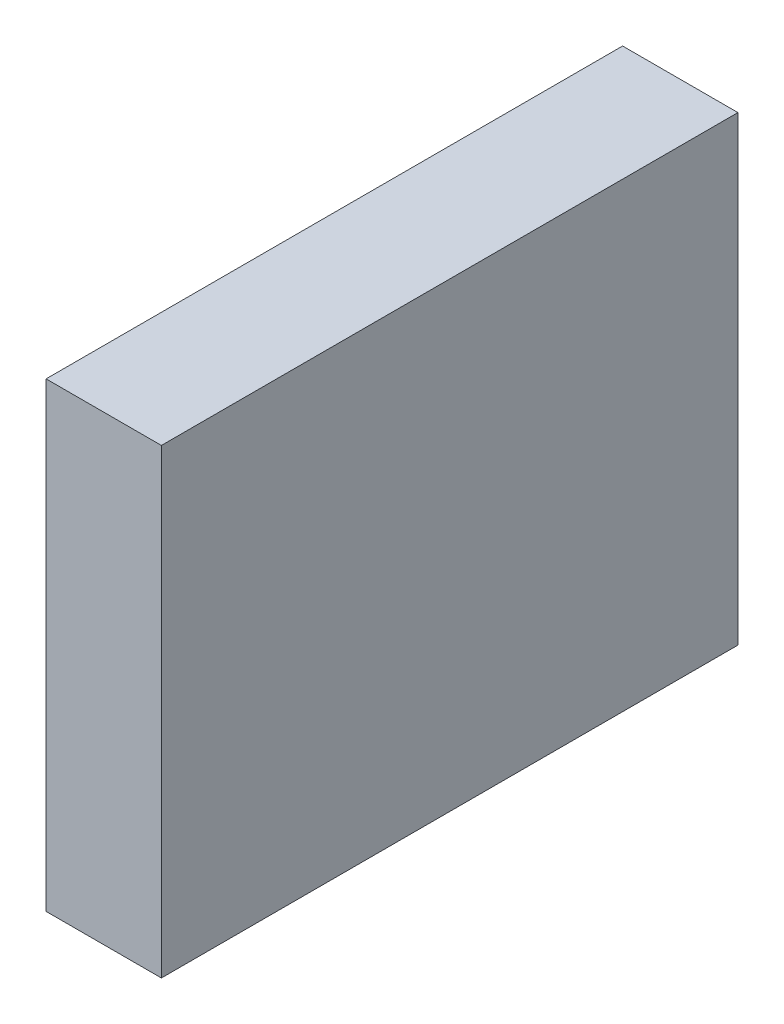
ISO-10303-21;
HEADER;
FILE_DESCRIPTION(('STEP AP214'),'2;1');
FILE_NAME('part.step','',(''),(''),'','','');
FILE_SCHEMA(('AUTOMOTIVE_DESIGN { 1 0 10303 214 1 1 1 1 }'));
ENDSEC;
DATA;
#1=APPLICATION_CONTEXT('core data for automotive mechanical design processes');
#2=APPLICATION_PROTOCOL_DEFINITION('international standard','automotive_design',2000,#1);
#3=PRODUCT_CONTEXT('',#1,'mechanical');
#4=PRODUCT('Part','Part','',(#3));
#5=PRODUCT_RELATED_PRODUCT_CATEGORY('part','',(#4));
#6=PRODUCT_DEFINITION_FORMATION('','',#4);
#7=PRODUCT_DEFINITION_CONTEXT('part definition',#1,'design');
#8=PRODUCT_DEFINITION('design','',#6,#7);
#9=PRODUCT_DEFINITION_SHAPE('','',#8);
#10=(LENGTH_UNIT() NAMED_UNIT(*) SI_UNIT(.MILLI.,.METRE.));
#11=(NAMED_UNIT(*) PLANE_ANGLE_UNIT() SI_UNIT($,.RADIAN.));
#12=(NAMED_UNIT(*) SI_UNIT($,.STERADIAN.) SOLID_ANGLE_UNIT());
#13=UNCERTAINTY_MEASURE_WITH_UNIT(LENGTH_MEASURE(1.E-05),#10,'distance_accuracy_value','');
#14=(GEOMETRIC_REPRESENTATION_CONTEXT(3) GLOBAL_UNCERTAINTY_ASSIGNED_CONTEXT((#13)) GLOBAL_UNIT_ASSIGNED_CONTEXT((#10,
#11,#12)) REPRESENTATION_CONTEXT('',''));
#15=CARTESIAN_POINT('',(0.,0.,0.));
#16=DIRECTION('',(0.,0.,1.));
#17=DIRECTION('',(1.,0.,0.));
#18=AXIS2_PLACEMENT_3D('',#15,#16,#17);
#19=CARTESIAN_POINT('',(-5.,40.,-25.));
#20=DIRECTION('',(1.,0.,0.));
#21=DIRECTION('',(0.,0.,-1.));
#22=AXIS2_PLACEMENT_3D('',#19,#20,#21);
#23=PLANE('',#22);
#24=DIRECTION('',(0.,0.,1.));
#25=VECTOR('',#24,1.);
#26=CARTESIAN_POINT('',(-5.,0.,-25.));
#27=LINE('',#26,#25);
#28=CARTESIAN_POINT('',(-5.,0.,-25.));
#29=VERTEX_POINT('',#28);
#30=CARTESIAN_POINT('',(-5.,0.,25.));
#31=VERTEX_POINT('',#30);
#32=EDGE_CURVE('E114',#29,#31,#27,.T.);
#33=ORIENTED_EDGE('',*,*,#32,.T.);
#34=DIRECTION('',(0.,-1.,0.));
#35=VECTOR('',#34,1.);
#36=CARTESIAN_POINT('',(-5.,40.,25.));
#37=LINE('',#36,#35);
#38=CARTESIAN_POINT('',(-5.,40.,25.));
#39=VERTEX_POINT('',#38);
#40=EDGE_CURVE('E11',#39,#31,#37,.T.);
#41=ORIENTED_EDGE('',*,*,#40,.F.);
#42=DIRECTION('',(0.,0.,1.));
#43=VECTOR('',#42,1.);
#44=CARTESIAN_POINT('',(-5.,40.,-25.));
#45=LINE('',#44,#43);
#46=CARTESIAN_POINT('',(-5.,40.,-25.));
#47=VERTEX_POINT('',#46);
#48=EDGE_CURVE('E100',#47,#39,#45,.T.);
#49=ORIENTED_EDGE('',*,*,#48,.F.);
#50=DIRECTION('',(0.,-1.,0.));
#51=VECTOR('',#50,1.);
#52=CARTESIAN_POINT('',(-5.,40.,-25.));
#53=LINE('',#52,#51);
#54=EDGE_CURVE('E108',#47,#29,#53,.T.);
#55=ORIENTED_EDGE('',*,*,#54,.T.);
#56=EDGE_LOOP('',(#33,#41,#49,#55));
#57=FACE_BOUND('',#56,.T.);
#58=ADVANCED_FACE('F44',(#57),#23,.F.);
#59=CARTESIAN_POINT('',(5.,40.,25.));
#60=DIRECTION('',(0.,0.,-1.));
#61=DIRECTION('',(-1.,0.,0.));
#62=AXIS2_PLACEMENT_3D('',#59,#60,#61);
#63=PLANE('',#62);
#64=DIRECTION('',(1.,0.,0.));
#65=VECTOR('',#64,1.);
#66=CARTESIAN_POINT('',(5.,0.,25.));
#67=LINE('',#66,#65);
#68=CARTESIAN_POINT('',(5.,0.,25.));
#69=VERTEX_POINT('',#68);
#70=EDGE_CURVE('E105',#31,#69,#67,.T.);
#71=ORIENTED_EDGE('',*,*,#70,.T.);
#72=DIRECTION('',(0.,-1.,0.));
#73=VECTOR('',#72,1.);
#74=CARTESIAN_POINT('',(5.,40.,25.));
#75=LINE('',#74,#73);
#76=CARTESIAN_POINT('',(5.,40.,25.));
#77=VERTEX_POINT('',#76);
#78=EDGE_CURVE('E53',#77,#69,#75,.T.);
#79=ORIENTED_EDGE('',*,*,#78,.F.);
#80=DIRECTION('',(1.,0.,0.));
#81=VECTOR('',#80,1.);
#82=CARTESIAN_POINT('',(5.,40.,25.));
#83=LINE('',#82,#81);
#84=EDGE_CURVE('E95',#39,#77,#83,.T.);
#85=ORIENTED_EDGE('',*,*,#84,.F.);
#86=ORIENTED_EDGE('',*,*,#40,.T.);
#87=EDGE_LOOP('',(#71,#79,#85,#86));
#88=FACE_BOUND('',#87,.T.);
#89=ADVANCED_FACE('F101',(#88),#63,.F.);
#90=CARTESIAN_POINT('',(5.,40.,-25.));
#91=DIRECTION('',(-1.,0.,0.));
#92=DIRECTION('',(0.,0.,1.));
#93=AXIS2_PLACEMENT_3D('',#90,#91,#92);
#94=PLANE('',#93);
#95=DIRECTION('',(0.,0.,-1.));
#96=VECTOR('',#95,1.);
#97=CARTESIAN_POINT('',(5.,0.,-25.));
#98=LINE('',#97,#96);
#99=CARTESIAN_POINT('',(5.,0.,-25.));
#100=VERTEX_POINT('',#99);
#101=EDGE_CURVE('E78',#69,#100,#98,.T.);
#102=ORIENTED_EDGE('',*,*,#101,.T.);
#103=DIRECTION('',(0.,-1.,0.));
#104=VECTOR('',#103,1.);
#105=CARTESIAN_POINT('',(5.,40.,-25.));
#106=LINE('',#105,#104);
#107=CARTESIAN_POINT('',(5.,40.,-25.));
#108=VERTEX_POINT('',#107);
#109=EDGE_CURVE('E102',#108,#100,#106,.T.);
#110=ORIENTED_EDGE('',*,*,#109,.F.);
#111=DIRECTION('',(0.,0.,-1.));
#112=VECTOR('',#111,1.);
#113=CARTESIAN_POINT('',(5.,40.,-25.));
#114=LINE('',#113,#112);
#115=EDGE_CURVE('E92',#77,#108,#114,.T.);
#116=ORIENTED_EDGE('',*,*,#115,.F.);
#117=ORIENTED_EDGE('',*,*,#78,.T.);
#118=EDGE_LOOP('',(#102,#110,#116,#117));
#119=FACE_BOUND('',#118,.T.);
#120=ADVANCED_FACE('F104',(#119),#94,.F.);
#121=CARTESIAN_POINT('',(5.,40.,-25.));
#122=DIRECTION('',(0.,0.,1.));
#123=DIRECTION('',(1.,0.,0.));
#124=AXIS2_PLACEMENT_3D('',#121,#122,#123);
#125=PLANE('',#124);
#126=DIRECTION('',(-1.,0.,0.));
#127=VECTOR('',#126,1.);
#128=CARTESIAN_POINT('',(5.,0.,-25.));
#129=LINE('',#128,#127);
#130=EDGE_CURVE('E85',#100,#29,#129,.T.);
#131=ORIENTED_EDGE('',*,*,#130,.T.);
#132=ORIENTED_EDGE('',*,*,#54,.F.);
#133=DIRECTION('',(-1.,0.,0.));
#134=VECTOR('',#133,1.);
#135=CARTESIAN_POINT('',(5.,40.,-25.));
#136=LINE('',#135,#134);
#137=EDGE_CURVE('E61',#108,#47,#136,.T.);
#138=ORIENTED_EDGE('',*,*,#137,.F.);
#139=ORIENTED_EDGE('',*,*,#109,.T.);
#140=EDGE_LOOP('',(#131,#132,#138,#139));
#141=FACE_BOUND('',#140,.T.);
#142=ADVANCED_FACE('F127',(#141),#125,.F.);
#143=CARTESIAN_POINT('',(0.,40.,0.));
#144=DIRECTION('',(0.,-1.,0.));
#145=DIRECTION('',(0.,0.,-1.));
#146=AXIS2_PLACEMENT_3D('',#143,#144,#145);
#147=PLANE('',#146);
#148=ORIENTED_EDGE('',*,*,#48,.T.);
#149=ORIENTED_EDGE('',*,*,#84,.T.);
#150=ORIENTED_EDGE('',*,*,#115,.T.);
#151=ORIENTED_EDGE('',*,*,#137,.T.);
#152=EDGE_LOOP('',(#148,#149,#150,#151));
#153=FACE_BOUND('',#152,.T.);
#154=ADVANCED_FACE('F91',(#153),#147,.F.);
#155=CARTESIAN_POINT('',(0.,0.,0.));
#156=DIRECTION('',(0.,-1.,0.));
#157=DIRECTION('',(0.,0.,-1.));
#158=AXIS2_PLACEMENT_3D('',#155,#156,#157);
#159=PLANE('',#158);
#160=ORIENTED_EDGE('',*,*,#32,.F.);
#161=ORIENTED_EDGE('',*,*,#130,.F.);
#162=ORIENTED_EDGE('',*,*,#101,.F.);
#163=ORIENTED_EDGE('',*,*,#70,.F.);
#164=EDGE_LOOP('',(#160,#161,#162,#163));
#165=FACE_BOUND('',#164,.T.);
#166=ADVANCED_FACE('F129',(#165),#159,.T.);
#167=CLOSED_SHELL('',(#58,#89,#120,#142,#154,#166));
#168=MANIFOLD_SOLID_BREP('B2',#167);
#169=ADVANCED_BREP_SHAPE_REPRESENTATION('',(#18,#168),#14);
#170=SHAPE_DEFINITION_REPRESENTATION(#9,#169);
ENDSEC;
END-ISO-10303-21;
